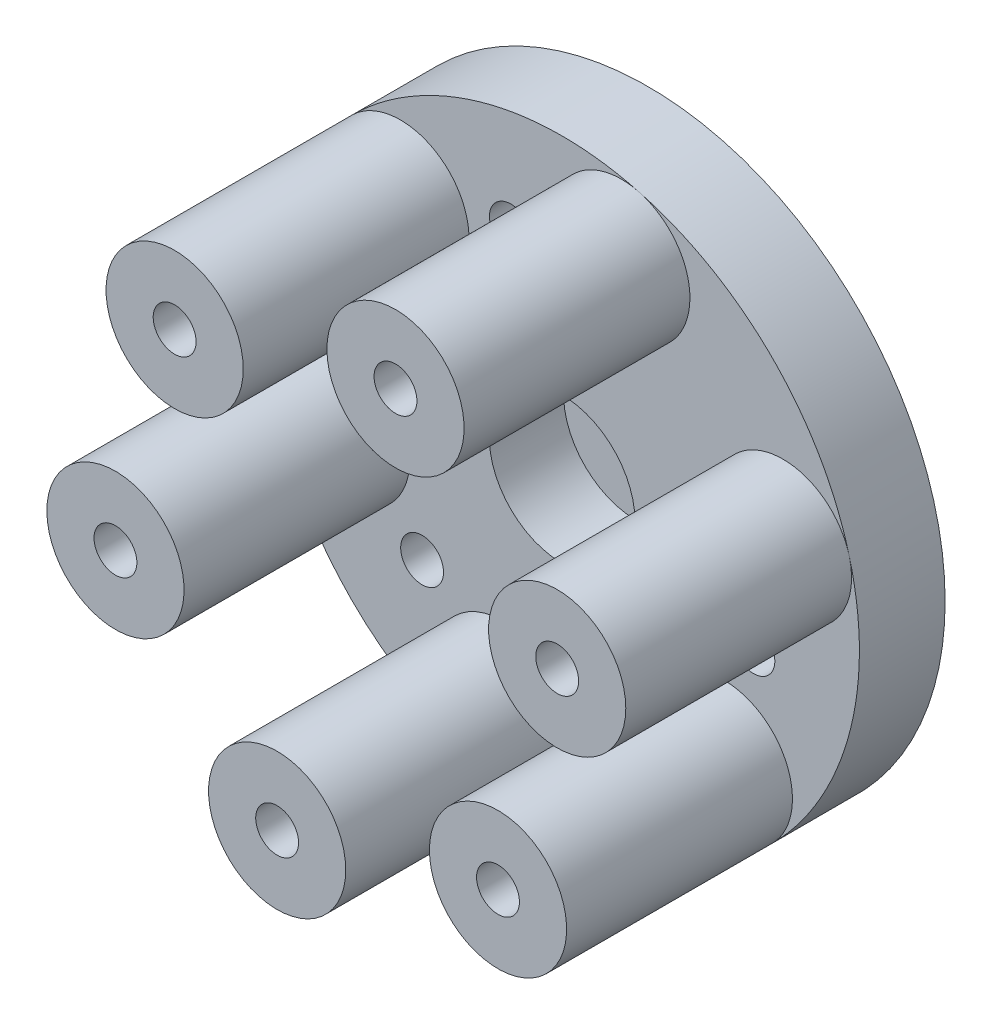
ISO-10303-21;
HEADER;
FILE_DESCRIPTION(('STEP AP214'),'2;1');
FILE_NAME('part.step','',(''),(''),'','','');
FILE_SCHEMA(('AUTOMOTIVE_DESIGN { 1 0 10303 214 1 1 1 1 }'));
ENDSEC;
DATA;
#1=APPLICATION_CONTEXT('core data for automotive mechanical design processes');
#2=APPLICATION_PROTOCOL_DEFINITION('international standard','automotive_design',2000,#1);
#3=PRODUCT_CONTEXT('',#1,'mechanical');
#4=PRODUCT('Part','Part','',(#3));
#5=PRODUCT_RELATED_PRODUCT_CATEGORY('part','',(#4));
#6=PRODUCT_DEFINITION_FORMATION('','',#4);
#7=PRODUCT_DEFINITION_CONTEXT('part definition',#1,'design');
#8=PRODUCT_DEFINITION('design','',#6,#7);
#9=PRODUCT_DEFINITION_SHAPE('','',#8);
#10=(LENGTH_UNIT() NAMED_UNIT(*) SI_UNIT(.MILLI.,.METRE.));
#11=(NAMED_UNIT(*) PLANE_ANGLE_UNIT() SI_UNIT($,.RADIAN.));
#12=(NAMED_UNIT(*) SI_UNIT($,.STERADIAN.) SOLID_ANGLE_UNIT());
#13=UNCERTAINTY_MEASURE_WITH_UNIT(LENGTH_MEASURE(1.E-05),#10,'distance_accuracy_value','');
#14=(GEOMETRIC_REPRESENTATION_CONTEXT(3) GLOBAL_UNCERTAINTY_ASSIGNED_CONTEXT((#13)) GLOBAL_UNIT_ASSIGNED_CONTEXT((#10,
#11,#12)) REPRESENTATION_CONTEXT('',''));
#15=CARTESIAN_POINT('',(0.,0.,0.));
#16=DIRECTION('',(0.,0.,1.));
#17=DIRECTION('',(1.,0.,0.));
#18=AXIS2_PLACEMENT_3D('',#15,#16,#17);
#19=CARTESIAN_POINT('',(0.,0.,0.));
#20=DIRECTION('',(0.,0.,1.));
#21=DIRECTION('',(1.,0.,0.));
#22=AXIS2_PLACEMENT_3D('',#19,#20,#21);
#23=CYLINDRICAL_SURFACE('',#22,1.1);
#24=CARTESIAN_POINT('',(0.,0.,0.));
#25=DIRECTION('',(0.,0.,1.));
#26=DIRECTION('',(1.,0.,0.));
#27=AXIS2_PLACEMENT_3D('',#24,#25,#26);
#28=CIRCLE('',#27,1.1);
#29=CARTESIAN_POINT('',(1.1,0.,0.));
#30=VERTEX_POINT('',#29);
#31=EDGE_CURVE('E283',#30,#30,#28,.T.);
#32=ORIENTED_EDGE('',*,*,#31,.F.);
#33=EDGE_LOOP('',(#32));
#34=FACE_BOUND('',#33,.T.);
#35=CARTESIAN_POINT('',(0.,0.,0.4));
#36=DIRECTION('',(0.,0.,1.));
#37=DIRECTION('',(1.,0.,0.));
#38=AXIS2_PLACEMENT_3D('',#35,#36,#37);
#39=CIRCLE('',#38,1.1);
#40=CARTESIAN_POINT('',(1.1,0.,0.4));
#41=VERTEX_POINT('',#40);
#42=EDGE_CURVE('E297',#41,#41,#39,.T.);
#43=ORIENTED_EDGE('',*,*,#42,.T.);
#44=EDGE_LOOP('',(#43));
#45=FACE_BOUND('',#44,.T.);
#46=ADVANCED_FACE('F39',(#34,#45),#23,.F.);
#47=CARTESIAN_POINT('',(0.,0.,3.));
#48=DIRECTION('',(0.,0.,-1.));
#49=DIRECTION('',(-1.,0.,0.));
#50=AXIS2_PLACEMENT_3D('',#47,#48,#49);
#51=CYLINDRICAL_SURFACE('',#50,10.4);
#52=CARTESIAN_POINT('',(0.,0.,3.));
#53=DIRECTION('',(0.,0.,1.));
#54=DIRECTION('',(1.,0.,0.));
#55=AXIS2_PLACEMENT_3D('',#52,#53,#54);
#56=CIRCLE('',#55,10.4);
#57=CARTESIAN_POINT('',(-7.35391052434006,7.35391052434013,3.));
#58=VERTEX_POINT('',#57);
#59=CARTESIAN_POINT('',(-10.0456285934064,-2.69171806906605,3.));
#60=VERTEX_POINT('',#59);
#61=EDGE_CURVE('E87',#58,#60,#56,.T.);
#62=ORIENTED_EDGE('',*,*,#61,.F.);
#63=CARTESIAN_POINT('',(2.69171806906629,10.0456285934063,3.));
#64=VERTEX_POINT('',#63);
#65=EDGE_CURVE('E74',#64,#58,#56,.T.);
#66=ORIENTED_EDGE('',*,*,#65,.F.);
#67=CARTESIAN_POINT('',(10.0456285934063,2.69171806906612,3.));
#68=VERTEX_POINT('',#67);
#69=EDGE_CURVE('E84',#68,#64,#56,.T.);
#70=ORIENTED_EDGE('',*,*,#69,.F.);
#71=CARTESIAN_POINT('',(7.35391052434006,-7.35391052434013,3.));
#72=VERTEX_POINT('',#71);
#73=EDGE_CURVE('E613',#72,#68,#56,.T.);
#74=ORIENTED_EDGE('',*,*,#73,.F.);
#75=CARTESIAN_POINT('',(-2.69171806906636,-10.0456285934063,3.));
#76=VERTEX_POINT('',#75);
#77=EDGE_CURVE('E94',#76,#72,#56,.T.);
#78=ORIENTED_EDGE('',*,*,#77,.F.);
#79=EDGE_CURVE('E58',#60,#76,#56,.T.);
#80=ORIENTED_EDGE('',*,*,#79,.F.);
#81=EDGE_LOOP('',(#62,#66,#70,#74,#78,#80));
#82=FACE_BOUND('',#81,.T.);
#83=CARTESIAN_POINT('',(0.,0.,0.));
#84=DIRECTION('',(0.,0.,1.));
#85=DIRECTION('',(1.,0.,0.));
#86=AXIS2_PLACEMENT_3D('',#83,#84,#85);
#87=CIRCLE('',#86,10.4);
#88=CARTESIAN_POINT('',(10.4,0.,0.));
#89=VERTEX_POINT('',#88);
#90=EDGE_CURVE('E85',#89,#89,#87,.T.);
#91=ORIENTED_EDGE('',*,*,#90,.T.);
#92=EDGE_LOOP('',(#91));
#93=FACE_BOUND('',#92,.T.);
#94=ADVANCED_FACE('F41',(#82,#93),#51,.T.);
#95=CARTESIAN_POINT('',(0.,0.,3.));
#96=DIRECTION('',(0.,0.,1.));
#97=DIRECTION('',(1.,0.,0.));
#98=AXIS2_PLACEMENT_3D('',#95,#96,#97);
#99=PLANE('',#98);
#100=CARTESIAN_POINT('',(0.,0.,3.));
#101=DIRECTION('',(0.,0.,1.));
#102=DIRECTION('',(1.,0.,0.));
#103=AXIS2_PLACEMENT_3D('',#100,#101,#102);
#104=CIRCLE('',#103,2.55);
#105=CARTESIAN_POINT('',(2.55,0.,3.));
#106=VERTEX_POINT('',#105);
#107=EDGE_CURVE('E294',#106,#106,#104,.T.);
#108=ORIENTED_EDGE('',*,*,#107,.F.);
#109=EDGE_LOOP('',(#108));
#110=FACE_BOUND('',#109,.T.);
#111=CARTESIAN_POINT('',(-4.89897948556636,-4.89897948556634,3.));
#112=DIRECTION('',(0.,0.,1.));
#113=DIRECTION('',(-0.500000000000004,0.866025403784436,0.));
#114=AXIS2_PLACEMENT_3D('',#111,#112,#113);
#115=CIRCLE('',#114,0.75);
#116=CARTESIAN_POINT('',(-5.27397948556637,-4.24946043272802,3.));
#117=VERTEX_POINT('',#116);
#118=EDGE_CURVE('E286',#117,#117,#115,.T.);
#119=ORIENTED_EDGE('',*,*,#118,.F.);
#120=EDGE_LOOP('',(#119));
#121=FACE_BOUND('',#120,.T.);
#122=CARTESIAN_POINT('',(6.69213042990246,-1.79315094433609,3.));
#123=DIRECTION('',(0.,0.,1.));
#124=DIRECTION('',(-0.499999999999992,-0.866025403784443,0.));
#125=AXIS2_PLACEMENT_3D('',#122,#123,#124);
#126=CIRCLE('',#125,0.75);
#127=CARTESIAN_POINT('',(6.31713042990247,-2.44266999717442,3.));
#128=VERTEX_POINT('',#127);
#129=EDGE_CURVE('E279',#128,#128,#126,.T.);
#130=ORIENTED_EDGE('',*,*,#129,.F.);
#131=EDGE_LOOP('',(#130));
#132=FACE_BOUND('',#131,.T.);
#133=CARTESIAN_POINT('',(-1.79315094433606,6.69213042990247,3.));
#134=DIRECTION('',(0.,0.,1.));
#135=DIRECTION('',(1.,0.,0.));
#136=AXIS2_PLACEMENT_3D('',#133,#134,#135);
#137=CIRCLE('',#136,0.75);
#138=CARTESIAN_POINT('',(-1.04315094433606,6.69213042990247,3.));
#139=VERTEX_POINT('',#138);
#140=EDGE_CURVE('E273',#139,#139,#137,.T.);
#141=ORIENTED_EDGE('',*,*,#140,.F.);
#142=EDGE_LOOP('',(#141));
#143=FACE_BOUND('',#142,.T.);
#144=ORIENTED_EDGE('',*,*,#61,.T.);
#145=CARTESIAN_POINT('',(-7.72740661031258,-2.07055236082003,3.));
#146=DIRECTION('',(0.,0.,1.));
#147=DIRECTION('',(0.50000000000001,0.866025403784433,0.));
#148=AXIS2_PLACEMENT_3D('',#145,#146,#147);
#149=CIRCLE('',#148,2.4);
#150=EDGE_CURVE('E52',#60,#60,#149,.T.);
#151=ORIENTED_EDGE('',*,*,#150,.F.);
#152=ORIENTED_EDGE('',*,*,#79,.T.);
#153=CARTESIAN_POINT('',(-2.07055236082028,-7.72740661031252,3.));
#154=DIRECTION('',(0.,0.,1.));
#155=DIRECTION('',(-0.499999999999992,0.866025403784443,0.));
#156=AXIS2_PLACEMENT_3D('',#153,#154,#155);
#157=CIRCLE('',#156,2.4);
#158=EDGE_CURVE('E258',#76,#76,#157,.T.);
#159=ORIENTED_EDGE('',*,*,#158,.F.);
#160=ORIENTED_EDGE('',*,*,#77,.T.);
#161=CARTESIAN_POINT('',(5.65685424949235,-5.65685424949241,3.));
#162=DIRECTION('',(0.,0.,1.));
#163=DIRECTION('',(-1.,0.,0.));
#164=AXIS2_PLACEMENT_3D('',#161,#162,#163);
#165=CIRCLE('',#164,2.4);
#166=EDGE_CURVE('E249',#72,#72,#165,.T.);
#167=ORIENTED_EDGE('',*,*,#166,.F.);
#168=ORIENTED_EDGE('',*,*,#73,.T.);
#169=CARTESIAN_POINT('',(7.72740661031257,2.07055236082009,3.));
#170=DIRECTION('',(0.,0.,1.));
#171=DIRECTION('',(-0.500000000000004,-0.866025403784436,0.));
#172=AXIS2_PLACEMENT_3D('',#169,#170,#171);
#173=CIRCLE('',#172,2.4);
#174=EDGE_CURVE('E240',#68,#68,#173,.T.);
#175=ORIENTED_EDGE('',*,*,#174,.F.);
#176=ORIENTED_EDGE('',*,*,#69,.T.);
#177=CARTESIAN_POINT('',(2.07055236082022,7.72740661031253,3.));
#178=DIRECTION('',(0.,0.,1.));
#179=DIRECTION('',(0.499999999999998,-0.86602540378444,0.));
#180=AXIS2_PLACEMENT_3D('',#177,#178,#179);
#181=CIRCLE('',#180,2.4);
#182=EDGE_CURVE('E81',#64,#64,#181,.T.);
#183=ORIENTED_EDGE('',*,*,#182,.F.);
#184=ORIENTED_EDGE('',*,*,#65,.T.);
#185=CARTESIAN_POINT('',(-5.65685424949235,5.65685424949241,3.));
#186=DIRECTION('',(0.,0.,1.));
#187=DIRECTION('',(1.,0.,0.));
#188=AXIS2_PLACEMENT_3D('',#185,#186,#187);
#189=CIRCLE('',#188,2.4);
#190=EDGE_CURVE('E79',#58,#58,#189,.T.);
#191=ORIENTED_EDGE('',*,*,#190,.F.);
#192=EDGE_LOOP('',(#144,#151,#152,#159,#160,#167,#168,#175,#176,#183,#184,#191));
#193=FACE_BOUND('',#192,.T.);
#194=ADVANCED_FACE('F77',(#110,#121,#132,#143,#193),#99,.T.);
#195=CARTESIAN_POINT('',(0.,0.,0.));
#196=DIRECTION('',(0.,0.,1.));
#197=DIRECTION('',(1.,0.,0.));
#198=AXIS2_PLACEMENT_3D('',#195,#196,#197);
#199=PLANE('',#198);
#200=ORIENTED_EDGE('',*,*,#31,.T.);
#201=EDGE_LOOP('',(#200));
#202=FACE_BOUND('',#201,.T.);
#203=CARTESIAN_POINT('',(-4.89897948556636,-4.89897948556634,0.));
#204=DIRECTION('',(0.,0.,1.));
#205=DIRECTION('',(-0.500000000000004,0.866025403784436,0.));
#206=AXIS2_PLACEMENT_3D('',#203,#204,#205);
#207=CIRCLE('',#206,0.75);
#208=CARTESIAN_POINT('',(-5.27397948556637,-4.24946043272802,0.));
#209=VERTEX_POINT('',#208);
#210=EDGE_CURVE('E276',#209,#209,#207,.T.);
#211=ORIENTED_EDGE('',*,*,#210,.T.);
#212=EDGE_LOOP('',(#211));
#213=FACE_BOUND('',#212,.T.);
#214=CARTESIAN_POINT('',(6.69213042990246,-1.79315094433609,0.));
#215=DIRECTION('',(0.,0.,1.));
#216=DIRECTION('',(-0.499999999999992,-0.866025403784443,0.));
#217=AXIS2_PLACEMENT_3D('',#214,#215,#216);
#218=CIRCLE('',#217,0.75);
#219=CARTESIAN_POINT('',(6.31713042990247,-2.44266999717442,0.));
#220=VERTEX_POINT('',#219);
#221=EDGE_CURVE('E282',#220,#220,#218,.T.);
#222=ORIENTED_EDGE('',*,*,#221,.T.);
#223=EDGE_LOOP('',(#222));
#224=FACE_BOUND('',#223,.T.);
#225=CARTESIAN_POINT('',(-1.79315094433606,6.69213042990247,0.));
#226=DIRECTION('',(0.,0.,1.));
#227=DIRECTION('',(1.,0.,0.));
#228=AXIS2_PLACEMENT_3D('',#225,#226,#227);
#229=CIRCLE('',#228,0.75);
#230=CARTESIAN_POINT('',(-1.04315094433606,6.69213042990247,0.));
#231=VERTEX_POINT('',#230);
#232=EDGE_CURVE('E272',#231,#231,#229,.T.);
#233=ORIENTED_EDGE('',*,*,#232,.T.);
#234=EDGE_LOOP('',(#233));
#235=FACE_BOUND('',#234,.T.);
#236=ORIENTED_EDGE('',*,*,#90,.F.);
#237=EDGE_LOOP('',(#236));
#238=FACE_BOUND('',#237,.T.);
#239=ADVANCED_FACE('F215',(#202,#213,#224,#235,#238),#199,.F.);
#240=CARTESIAN_POINT('',(-5.65685424949235,5.65685424949241,10.9));
#241=DIRECTION('',(0.,0.,1.));
#242=DIRECTION('',(1.,0.,0.));
#243=AXIS2_PLACEMENT_3D('',#240,#241,#242);
#244=PLANE('',#243);
#245=CARTESIAN_POINT('',(-5.65685424949235,5.65685424949241,10.9));
#246=DIRECTION('',(0.,0.,1.));
#247=DIRECTION('',(1.,0.,0.));
#248=AXIS2_PLACEMENT_3D('',#245,#246,#247);
#249=CIRCLE('',#248,2.4);
#250=CARTESIAN_POINT('',(-3.25685424949235,5.65685424949241,10.9));
#251=VERTEX_POINT('',#250);
#252=EDGE_CURVE('E99',#251,#251,#249,.T.);
#253=ORIENTED_EDGE('',*,*,#252,.T.);
#254=EDGE_LOOP('',(#253));
#255=FACE_BOUND('',#254,.T.);
#256=CARTESIAN_POINT('',(-5.65685424949235,5.65685424949241,10.9));
#257=DIRECTION('',(0.,0.,1.));
#258=DIRECTION('',(1.,0.,0.));
#259=AXIS2_PLACEMENT_3D('',#256,#257,#258);
#260=CIRCLE('',#259,0.75);
#261=CARTESIAN_POINT('',(-4.90685424949235,5.65685424949241,10.9));
#262=VERTEX_POINT('',#261);
#263=EDGE_CURVE('E224',#262,#262,#260,.T.);
#264=ORIENTED_EDGE('',*,*,#263,.F.);
#265=EDGE_LOOP('',(#264));
#266=FACE_BOUND('',#265,.T.);
#267=ADVANCED_FACE('F213',(#255,#266),#244,.T.);
#268=CARTESIAN_POINT('',(-5.65685424949235,5.65685424949241,10.9));
#269=DIRECTION('',(0.,0.,-1.));
#270=DIRECTION('',(-1.,0.,0.));
#271=AXIS2_PLACEMENT_3D('',#268,#269,#270);
#272=CYLINDRICAL_SURFACE('',#271,2.4);
#273=ORIENTED_EDGE('',*,*,#252,.F.);
#274=EDGE_LOOP('',(#273));
#275=FACE_BOUND('',#274,.T.);
#276=ORIENTED_EDGE('',*,*,#190,.T.);
#277=EDGE_LOOP('',(#276));
#278=FACE_BOUND('',#277,.T.);
#279=ADVANCED_FACE('F211',(#275,#278),#272,.T.);
#280=CARTESIAN_POINT('',(-5.65685424949235,5.65685424949241,10.9));
#281=DIRECTION('',(0.,0.,-1.));
#282=DIRECTION('',(-1.,0.,0.));
#283=AXIS2_PLACEMENT_3D('',#280,#281,#282);
#284=CYLINDRICAL_SURFACE('',#283,0.75);
#285=ORIENTED_EDGE('',*,*,#263,.T.);
#286=EDGE_LOOP('',(#285));
#287=FACE_BOUND('',#286,.T.);
#288=CARTESIAN_POINT('',(-5.65685424949235,5.65685424949241,3.));
#289=DIRECTION('',(0.,0.,1.));
#290=DIRECTION('',(1.,0.,0.));
#291=AXIS2_PLACEMENT_3D('',#288,#289,#290);
#292=CIRCLE('',#291,0.75);
#293=CARTESIAN_POINT('',(-4.90685424949235,5.65685424949241,3.));
#294=VERTEX_POINT('',#293);
#295=EDGE_CURVE('E226',#294,#294,#292,.T.);
#296=ORIENTED_EDGE('',*,*,#295,.F.);
#297=EDGE_LOOP('',(#296));
#298=FACE_BOUND('',#297,.T.);
#299=ADVANCED_FACE('F208',(#287,#298),#284,.F.);
#300=ORIENTED_EDGE('',*,*,#295,.T.);
#301=EDGE_LOOP('',(#300));
#302=FACE_BOUND('',#301,.T.);
#303=ADVANCED_FACE('F203',(#302),#99,.T.);
#304=CARTESIAN_POINT('',(2.07055236082022,7.72740661031253,10.9));
#305=DIRECTION('',(0.,0.,1.));
#306=DIRECTION('',(0.499999999999998,-0.86602540378444,0.));
#307=AXIS2_PLACEMENT_3D('',#304,#305,#306);
#308=PLANE('',#307);
#309=CARTESIAN_POINT('',(2.07055236082022,7.72740661031253,10.9));
#310=DIRECTION('',(0.,0.,1.));
#311=DIRECTION('',(0.499999999999998,-0.86602540378444,0.));
#312=AXIS2_PLACEMENT_3D('',#309,#310,#311);
#313=CIRCLE('',#312,2.4);
#314=CARTESIAN_POINT('',(3.27055236082022,5.64894564122988,10.9));
#315=VERTEX_POINT('',#314);
#316=EDGE_CURVE('E230',#315,#315,#313,.T.);
#317=ORIENTED_EDGE('',*,*,#316,.T.);
#318=EDGE_LOOP('',(#317));
#319=FACE_BOUND('',#318,.T.);
#320=CARTESIAN_POINT('',(2.07055236082022,7.72740661031253,10.9));
#321=DIRECTION('',(0.,0.,1.));
#322=DIRECTION('',(0.499999999999998,-0.86602540378444,0.));
#323=AXIS2_PLACEMENT_3D('',#320,#321,#322);
#324=CIRCLE('',#323,0.75);
#325=CARTESIAN_POINT('',(2.44555236082022,7.0778875574742,10.9));
#326=VERTEX_POINT('',#325);
#327=EDGE_CURVE('E234',#326,#326,#324,.T.);
#328=ORIENTED_EDGE('',*,*,#327,.F.);
#329=EDGE_LOOP('',(#328));
#330=FACE_BOUND('',#329,.T.);
#331=ADVANCED_FACE('F200',(#319,#330),#308,.T.);
#332=CARTESIAN_POINT('',(2.07055236082022,7.72740661031253,10.9));
#333=DIRECTION('',(0.,0.,-1.));
#334=DIRECTION('',(-1.,0.,0.));
#335=AXIS2_PLACEMENT_3D('',#332,#333,#334);
#336=CYLINDRICAL_SURFACE('',#335,2.4);
#337=ORIENTED_EDGE('',*,*,#316,.F.);
#338=EDGE_LOOP('',(#337));
#339=FACE_BOUND('',#338,.T.);
#340=ORIENTED_EDGE('',*,*,#182,.T.);
#341=EDGE_LOOP('',(#340));
#342=FACE_BOUND('',#341,.T.);
#343=ADVANCED_FACE('F198',(#339,#342),#336,.T.);
#344=CARTESIAN_POINT('',(2.07055236082022,7.72740661031253,10.9));
#345=DIRECTION('',(0.,0.,-1.));
#346=DIRECTION('',(-1.,0.,0.));
#347=AXIS2_PLACEMENT_3D('',#344,#345,#346);
#348=CYLINDRICAL_SURFACE('',#347,0.75);
#349=ORIENTED_EDGE('',*,*,#327,.T.);
#350=EDGE_LOOP('',(#349));
#351=FACE_BOUND('',#350,.T.);
#352=CARTESIAN_POINT('',(2.07055236082022,7.72740661031253,3.));
#353=DIRECTION('',(0.,0.,1.));
#354=DIRECTION('',(1.,0.,0.));
#355=AXIS2_PLACEMENT_3D('',#352,#353,#354);
#356=CIRCLE('',#355,0.75);
#357=CARTESIAN_POINT('',(2.82055236082023,7.72740661031253,3.));
#358=VERTEX_POINT('',#357);
#359=EDGE_CURVE('E90',#358,#358,#356,.F.);
#360=ORIENTED_EDGE('',*,*,#359,.T.);
#361=EDGE_LOOP('',(#360));
#362=FACE_BOUND('',#361,.T.);
#363=ADVANCED_FACE('F195',(#351,#362),#348,.F.);
#364=ORIENTED_EDGE('',*,*,#359,.F.);
#365=EDGE_LOOP('',(#364));
#366=FACE_BOUND('',#365,.T.);
#367=ADVANCED_FACE('F190',(#366),#99,.T.);
#368=CARTESIAN_POINT('',(7.72740661031257,2.07055236082009,10.9));
#369=DIRECTION('',(0.,0.,1.));
#370=DIRECTION('',(-0.500000000000004,-0.866025403784436,0.));
#371=AXIS2_PLACEMENT_3D('',#368,#369,#370);
#372=PLANE('',#371);
#373=CARTESIAN_POINT('',(7.72740661031257,2.07055236082009,10.9));
#374=DIRECTION('',(0.,0.,1.));
#375=DIRECTION('',(-0.500000000000004,-0.866025403784436,0.));
#376=AXIS2_PLACEMENT_3D('',#373,#374,#375);
#377=CIRCLE('',#376,2.4);
#378=CARTESIAN_POINT('',(6.52740661031256,-0.00790860826255799,10.9));
#379=VERTEX_POINT('',#378);
#380=EDGE_CURVE('E239',#379,#379,#377,.T.);
#381=ORIENTED_EDGE('',*,*,#380,.T.);
#382=EDGE_LOOP('',(#381));
#383=FACE_BOUND('',#382,.T.);
#384=CARTESIAN_POINT('',(7.72740661031257,2.07055236082009,10.9));
#385=DIRECTION('',(0.,0.,1.));
#386=DIRECTION('',(-0.500000000000004,-0.866025403784436,0.));
#387=AXIS2_PLACEMENT_3D('',#384,#385,#386);
#388=CIRCLE('',#387,0.75);
#389=CARTESIAN_POINT('',(7.35240661031257,1.42103330798176,10.9));
#390=VERTEX_POINT('',#389);
#391=EDGE_CURVE('E243',#390,#390,#388,.T.);
#392=ORIENTED_EDGE('',*,*,#391,.F.);
#393=EDGE_LOOP('',(#392));
#394=FACE_BOUND('',#393,.T.);
#395=ADVANCED_FACE('F187',(#383,#394),#372,.T.);
#396=CARTESIAN_POINT('',(7.72740661031257,2.07055236082009,10.9));
#397=DIRECTION('',(0.,0.,-1.));
#398=DIRECTION('',(-1.,0.,0.));
#399=AXIS2_PLACEMENT_3D('',#396,#397,#398);
#400=CYLINDRICAL_SURFACE('',#399,2.4);
#401=ORIENTED_EDGE('',*,*,#380,.F.);
#402=EDGE_LOOP('',(#401));
#403=FACE_BOUND('',#402,.T.);
#404=ORIENTED_EDGE('',*,*,#174,.T.);
#405=EDGE_LOOP('',(#404));
#406=FACE_BOUND('',#405,.T.);
#407=ADVANCED_FACE('F185',(#403,#406),#400,.T.);
#408=CARTESIAN_POINT('',(7.72740661031257,2.07055236082009,10.9));
#409=DIRECTION('',(0.,0.,-1.));
#410=DIRECTION('',(-1.,0.,0.));
#411=AXIS2_PLACEMENT_3D('',#408,#409,#410);
#412=CYLINDRICAL_SURFACE('',#411,0.75);
#413=ORIENTED_EDGE('',*,*,#391,.T.);
#414=EDGE_LOOP('',(#413));
#415=FACE_BOUND('',#414,.T.);
#416=CARTESIAN_POINT('',(7.72740661031257,2.07055236082009,3.));
#417=DIRECTION('',(0.,0.,1.));
#418=DIRECTION('',(1.,0.,0.));
#419=AXIS2_PLACEMENT_3D('',#416,#417,#418);
#420=CIRCLE('',#419,0.75);
#421=CARTESIAN_POINT('',(8.47740661031257,2.07055236082009,3.));
#422=VERTEX_POINT('',#421);
#423=EDGE_CURVE('E92',#422,#422,#420,.F.);
#424=ORIENTED_EDGE('',*,*,#423,.T.);
#425=EDGE_LOOP('',(#424));
#426=FACE_BOUND('',#425,.T.);
#427=ADVANCED_FACE('F182',(#415,#426),#412,.F.);
#428=ORIENTED_EDGE('',*,*,#423,.F.);
#429=EDGE_LOOP('',(#428));
#430=FACE_BOUND('',#429,.T.);
#431=ADVANCED_FACE('F131',(#430),#99,.T.);
#432=CARTESIAN_POINT('',(5.65685424949235,-5.65685424949241,10.9));
#433=DIRECTION('',(0.,0.,1.));
#434=DIRECTION('',(-1.,0.,0.));
#435=AXIS2_PLACEMENT_3D('',#432,#433,#434);
#436=PLANE('',#435);
#437=CARTESIAN_POINT('',(5.65685424949235,-5.65685424949241,10.9));
#438=DIRECTION('',(0.,0.,1.));
#439=DIRECTION('',(-1.,0.,0.));
#440=AXIS2_PLACEMENT_3D('',#437,#438,#439);
#441=CIRCLE('',#440,2.4);
#442=CARTESIAN_POINT('',(3.25685424949235,-5.65685424949241,10.9));
#443=VERTEX_POINT('',#442);
#444=EDGE_CURVE('E248',#443,#443,#441,.T.);
#445=ORIENTED_EDGE('',*,*,#444,.T.);
#446=EDGE_LOOP('',(#445));
#447=FACE_BOUND('',#446,.T.);
#448=CARTESIAN_POINT('',(5.65685424949235,-5.65685424949241,10.9));
#449=DIRECTION('',(0.,0.,1.));
#450=DIRECTION('',(-1.,0.,0.));
#451=AXIS2_PLACEMENT_3D('',#448,#449,#450);
#452=CIRCLE('',#451,0.75);
#453=CARTESIAN_POINT('',(4.90685424949235,-5.65685424949241,10.9));
#454=VERTEX_POINT('',#453);
#455=EDGE_CURVE('E252',#454,#454,#452,.T.);
#456=ORIENTED_EDGE('',*,*,#455,.F.);
#457=EDGE_LOOP('',(#456));
#458=FACE_BOUND('',#457,.T.);
#459=ADVANCED_FACE('F175',(#447,#458),#436,.T.);
#460=CARTESIAN_POINT('',(5.65685424949235,-5.65685424949241,10.9));
#461=DIRECTION('',(0.,0.,-1.));
#462=DIRECTION('',(-1.,0.,0.));
#463=AXIS2_PLACEMENT_3D('',#460,#461,#462);
#464=CYLINDRICAL_SURFACE('',#463,2.4);
#465=ORIENTED_EDGE('',*,*,#444,.F.);
#466=EDGE_LOOP('',(#465));
#467=FACE_BOUND('',#466,.T.);
#468=ORIENTED_EDGE('',*,*,#166,.T.);
#469=EDGE_LOOP('',(#468));
#470=FACE_BOUND('',#469,.T.);
#471=ADVANCED_FACE('F173',(#467,#470),#464,.T.);
#472=CARTESIAN_POINT('',(5.65685424949235,-5.65685424949241,10.9));
#473=DIRECTION('',(0.,0.,-1.));
#474=DIRECTION('',(-1.,0.,0.));
#475=AXIS2_PLACEMENT_3D('',#472,#473,#474);
#476=CYLINDRICAL_SURFACE('',#475,0.75);
#477=ORIENTED_EDGE('',*,*,#455,.T.);
#478=EDGE_LOOP('',(#477));
#479=FACE_BOUND('',#478,.T.);
#480=CARTESIAN_POINT('',(5.65685424949235,-5.65685424949241,3.));
#481=DIRECTION('',(0.,0.,1.));
#482=DIRECTION('',(1.,0.,0.));
#483=AXIS2_PLACEMENT_3D('',#480,#481,#482);
#484=CIRCLE('',#483,0.75);
#485=CARTESIAN_POINT('',(6.40685424949235,-5.65685424949241,3.));
#486=VERTEX_POINT('',#485);
#487=EDGE_CURVE('E103',#486,#486,#484,.F.);
#488=ORIENTED_EDGE('',*,*,#487,.T.);
#489=EDGE_LOOP('',(#488));
#490=FACE_BOUND('',#489,.T.);
#491=ADVANCED_FACE('F129',(#479,#490),#476,.F.);
#492=ORIENTED_EDGE('',*,*,#487,.F.);
#493=EDGE_LOOP('',(#492));
#494=FACE_BOUND('',#493,.T.);
#495=ADVANCED_FACE('F114',(#494),#99,.T.);
#496=CARTESIAN_POINT('',(-2.07055236082028,-7.72740661031252,10.9));
#497=DIRECTION('',(0.,0.,1.));
#498=DIRECTION('',(-0.499999999999992,0.866025403784443,0.));
#499=AXIS2_PLACEMENT_3D('',#496,#497,#498);
#500=PLANE('',#499);
#501=CARTESIAN_POINT('',(-2.07055236082028,-7.72740661031252,10.9));
#502=DIRECTION('',(0.,0.,1.));
#503=DIRECTION('',(-0.499999999999992,0.866025403784443,0.));
#504=AXIS2_PLACEMENT_3D('',#501,#502,#503);
#505=CIRCLE('',#504,2.4);
#506=CARTESIAN_POINT('',(-3.27055236082026,-5.64894564122985,10.9));
#507=VERTEX_POINT('',#506);
#508=EDGE_CURVE('E257',#507,#507,#505,.T.);
#509=ORIENTED_EDGE('',*,*,#508,.T.);
#510=EDGE_LOOP('',(#509));
#511=FACE_BOUND('',#510,.T.);
#512=CARTESIAN_POINT('',(-2.07055236082028,-7.72740661031252,10.9));
#513=DIRECTION('',(0.,0.,1.));
#514=DIRECTION('',(-0.499999999999992,0.866025403784443,0.));
#515=AXIS2_PLACEMENT_3D('',#512,#513,#514);
#516=CIRCLE('',#515,0.75);
#517=CARTESIAN_POINT('',(-2.44555236082027,-7.07788755747418,10.9));
#518=VERTEX_POINT('',#517);
#519=EDGE_CURVE('E260',#518,#518,#516,.T.);
#520=ORIENTED_EDGE('',*,*,#519,.F.);
#521=EDGE_LOOP('',(#520));
#522=FACE_BOUND('',#521,.T.);
#523=ADVANCED_FACE('F128',(#511,#522),#500,.T.);
#524=CARTESIAN_POINT('',(-2.07055236082028,-7.72740661031252,10.9));
#525=DIRECTION('',(0.,0.,-1.));
#526=DIRECTION('',(-1.,0.,0.));
#527=AXIS2_PLACEMENT_3D('',#524,#525,#526);
#528=CYLINDRICAL_SURFACE('',#527,2.4);
#529=ORIENTED_EDGE('',*,*,#508,.F.);
#530=EDGE_LOOP('',(#529));
#531=FACE_BOUND('',#530,.T.);
#532=ORIENTED_EDGE('',*,*,#158,.T.);
#533=EDGE_LOOP('',(#532));
#534=FACE_BOUND('',#533,.T.);
#535=ADVANCED_FACE('F123',(#531,#534),#528,.T.);
#536=CARTESIAN_POINT('',(-2.07055236082028,-7.72740661031252,10.9));
#537=DIRECTION('',(0.,0.,-1.));
#538=DIRECTION('',(-1.,0.,0.));
#539=AXIS2_PLACEMENT_3D('',#536,#537,#538);
#540=CYLINDRICAL_SURFACE('',#539,0.75);
#541=ORIENTED_EDGE('',*,*,#519,.T.);
#542=EDGE_LOOP('',(#541));
#543=FACE_BOUND('',#542,.T.);
#544=CARTESIAN_POINT('',(-2.07055236082028,-7.72740661031252,3.));
#545=DIRECTION('',(0.,0.,1.));
#546=DIRECTION('',(1.,0.,0.));
#547=AXIS2_PLACEMENT_3D('',#544,#545,#546);
#548=CIRCLE('',#547,0.75);
#549=CARTESIAN_POINT('',(-1.32055236082028,-7.72740661031252,3.));
#550=VERTEX_POINT('',#549);
#551=EDGE_CURVE('E47',#550,#550,#548,.F.);
#552=ORIENTED_EDGE('',*,*,#551,.T.);
#553=EDGE_LOOP('',(#552));
#554=FACE_BOUND('',#553,.T.);
#555=ADVANCED_FACE('F108',(#543,#554),#540,.F.);
#556=ORIENTED_EDGE('',*,*,#551,.F.);
#557=EDGE_LOOP('',(#556));
#558=FACE_BOUND('',#557,.T.);
#559=ADVANCED_FACE('F110',(#558),#99,.T.);
#560=CARTESIAN_POINT('',(-7.72740661031258,-2.07055236082003,10.9));
#561=DIRECTION('',(0.,0.,1.));
#562=DIRECTION('',(0.50000000000001,0.866025403784433,0.));
#563=AXIS2_PLACEMENT_3D('',#560,#561,#562);
#564=PLANE('',#563);
#565=CARTESIAN_POINT('',(-7.72740661031258,-2.07055236082003,10.9));
#566=DIRECTION('',(0.,0.,1.));
#567=DIRECTION('',(0.50000000000001,0.866025403784433,0.));
#568=AXIS2_PLACEMENT_3D('',#565,#566,#567);
#569=CIRCLE('',#568,2.4);
#570=CARTESIAN_POINT('',(-6.52740661031256,0.00790860826260396,10.9));
#571=VERTEX_POINT('',#570);
#572=EDGE_CURVE('E265',#571,#571,#569,.T.);
#573=ORIENTED_EDGE('',*,*,#572,.T.);
#574=EDGE_LOOP('',(#573));
#575=FACE_BOUND('',#574,.T.);
#576=CARTESIAN_POINT('',(-7.72740661031258,-2.07055236082003,10.9));
#577=DIRECTION('',(0.,0.,1.));
#578=DIRECTION('',(0.50000000000001,0.866025403784433,0.));
#579=AXIS2_PLACEMENT_3D('',#576,#577,#578);
#580=CIRCLE('',#579,0.75);
#581=CARTESIAN_POINT('',(-7.35240661031257,-1.42103330798171,10.9));
#582=VERTEX_POINT('',#581);
#583=EDGE_CURVE('E267',#582,#582,#580,.T.);
#584=ORIENTED_EDGE('',*,*,#583,.F.);
#585=EDGE_LOOP('',(#584));
#586=FACE_BOUND('',#585,.T.);
#587=ADVANCED_FACE('F112',(#575,#586),#564,.T.);
#588=CARTESIAN_POINT('',(-7.72740661031258,-2.07055236082003,10.9));
#589=DIRECTION('',(0.,0.,-1.));
#590=DIRECTION('',(-1.,0.,0.));
#591=AXIS2_PLACEMENT_3D('',#588,#589,#590);
#592=CYLINDRICAL_SURFACE('',#591,2.4);
#593=ORIENTED_EDGE('',*,*,#572,.F.);
#594=EDGE_LOOP('',(#593));
#595=FACE_BOUND('',#594,.T.);
#596=ORIENTED_EDGE('',*,*,#150,.T.);
#597=EDGE_LOOP('',(#596));
#598=FACE_BOUND('',#597,.T.);
#599=ADVANCED_FACE('F120',(#595,#598),#592,.T.);
#600=CARTESIAN_POINT('',(-7.72740661031258,-2.07055236082003,10.9));
#601=DIRECTION('',(0.,0.,-1.));
#602=DIRECTION('',(-1.,0.,0.));
#603=AXIS2_PLACEMENT_3D('',#600,#601,#602);
#604=CYLINDRICAL_SURFACE('',#603,0.75);
#605=ORIENTED_EDGE('',*,*,#583,.T.);
#606=EDGE_LOOP('',(#605));
#607=FACE_BOUND('',#606,.T.);
#608=CARTESIAN_POINT('',(-7.72740661031258,-2.07055236082003,3.));
#609=DIRECTION('',(0.,0.,1.));
#610=DIRECTION('',(1.,0.,0.));
#611=AXIS2_PLACEMENT_3D('',#608,#609,#610);
#612=CIRCLE('',#611,0.75);
#613=CARTESIAN_POINT('',(-6.97740661031258,-2.07055236082003,3.));
#614=VERTEX_POINT('',#613);
#615=EDGE_CURVE('E11',#614,#614,#612,.F.);
#616=ORIENTED_EDGE('',*,*,#615,.T.);
#617=EDGE_LOOP('',(#616));
#618=FACE_BOUND('',#617,.T.);
#619=ADVANCED_FACE('F134',(#607,#618),#604,.F.);
#620=ORIENTED_EDGE('',*,*,#615,.F.);
#621=EDGE_LOOP('',(#620));
#622=FACE_BOUND('',#621,.T.);
#623=ADVANCED_FACE('F115',(#622),#99,.T.);
#624=CARTESIAN_POINT('',(-1.79315094433606,6.69213042990247,0.));
#625=DIRECTION('',(0.,0.,1.));
#626=DIRECTION('',(1.,0.,0.));
#627=AXIS2_PLACEMENT_3D('',#624,#625,#626);
#628=CYLINDRICAL_SURFACE('',#627,0.75);
#629=ORIENTED_EDGE('',*,*,#232,.F.);
#630=EDGE_LOOP('',(#629));
#631=FACE_BOUND('',#630,.T.);
#632=ORIENTED_EDGE('',*,*,#140,.T.);
#633=EDGE_LOOP('',(#632));
#634=FACE_BOUND('',#633,.T.);
#635=ADVANCED_FACE('F133',(#631,#634),#628,.F.);
#636=CARTESIAN_POINT('',(6.69213042990246,-1.79315094433609,0.));
#637=DIRECTION('',(0.,0.,1.));
#638=DIRECTION('',(1.,0.,0.));
#639=AXIS2_PLACEMENT_3D('',#636,#637,#638);
#640=CYLINDRICAL_SURFACE('',#639,0.75);
#641=ORIENTED_EDGE('',*,*,#221,.F.);
#642=EDGE_LOOP('',(#641));
#643=FACE_BOUND('',#642,.T.);
#644=ORIENTED_EDGE('',*,*,#129,.T.);
#645=EDGE_LOOP('',(#644));
#646=FACE_BOUND('',#645,.T.);
#647=ADVANCED_FACE('F151',(#643,#646),#640,.F.);
#648=CARTESIAN_POINT('',(-4.89897948556636,-4.89897948556634,0.));
#649=DIRECTION('',(0.,0.,1.));
#650=DIRECTION('',(1.,0.,0.));
#651=AXIS2_PLACEMENT_3D('',#648,#649,#650);
#652=CYLINDRICAL_SURFACE('',#651,0.75);
#653=ORIENTED_EDGE('',*,*,#210,.F.);
#654=EDGE_LOOP('',(#653));
#655=FACE_BOUND('',#654,.T.);
#656=ORIENTED_EDGE('',*,*,#118,.T.);
#657=EDGE_LOOP('',(#656));
#658=FACE_BOUND('',#657,.T.);
#659=ADVANCED_FACE('F148',(#655,#658),#652,.F.);
#660=CARTESIAN_POINT('',(0.,0.,0.4));
#661=DIRECTION('',(0.,0.,1.));
#662=DIRECTION('',(1.,0.,0.));
#663=AXIS2_PLACEMENT_3D('',#660,#661,#662);
#664=CYLINDRICAL_SURFACE('',#663,2.55);
#665=CARTESIAN_POINT('',(0.,0.,0.4));
#666=DIRECTION('',(0.,0.,1.));
#667=DIRECTION('',(1.,0.,0.));
#668=AXIS2_PLACEMENT_3D('',#665,#666,#667);
#669=CIRCLE('',#668,2.55);
#670=CARTESIAN_POINT('',(2.55,0.,0.4));
#671=VERTEX_POINT('',#670);
#672=EDGE_CURVE('E293',#671,#671,#669,.T.);
#673=ORIENTED_EDGE('',*,*,#672,.F.);
#674=EDGE_LOOP('',(#673));
#675=FACE_BOUND('',#674,.T.);
#676=ORIENTED_EDGE('',*,*,#107,.T.);
#677=EDGE_LOOP('',(#676));
#678=FACE_BOUND('',#677,.T.);
#679=ADVANCED_FACE('F146',(#675,#678),#664,.F.);
#680=CARTESIAN_POINT('',(0.,0.,0.4));
#681=DIRECTION('',(0.,0.,1.));
#682=DIRECTION('',(1.,0.,0.));
#683=AXIS2_PLACEMENT_3D('',#680,#681,#682);
#684=PLANE('',#683);
#685=ORIENTED_EDGE('',*,*,#42,.F.);
#686=EDGE_LOOP('',(#685));
#687=FACE_BOUND('',#686,.T.);
#688=ORIENTED_EDGE('',*,*,#672,.T.);
#689=EDGE_LOOP('',(#688));
#690=FACE_BOUND('',#689,.T.);
#691=ADVANCED_FACE('F303',(#687,#690),#684,.T.);
#692=CLOSED_SHELL('',(#46,#94,#194,#239,#267,#279,#299,#303,#331,#343,#363,#367,#395,#407,#427,
#431,#459,#471,#491,#495,#523,#535,#555,#559,#587,#599,#619,#623,#635,#647,#659,#679,#691));
#693=MANIFOLD_SOLID_BREP('B2',#692);
#694=ADVANCED_BREP_SHAPE_REPRESENTATION('',(#18,#693),#14);
#695=SHAPE_DEFINITION_REPRESENTATION(#9,#694);
ENDSEC;
END-ISO-10303-21;
